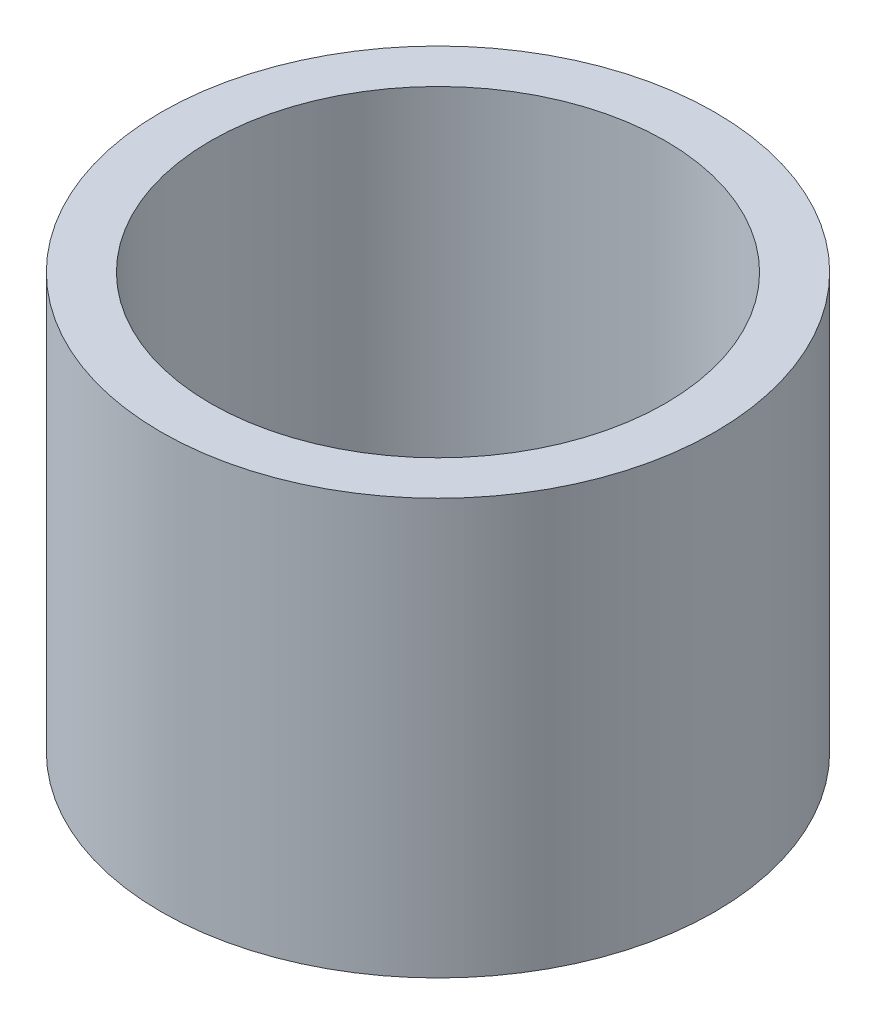
ISO-10303-21;
HEADER;
FILE_DESCRIPTION(('STEP AP214'),'2;1');
FILE_NAME('part.step','',(''),(''),'','','');
FILE_SCHEMA(('AUTOMOTIVE_DESIGN { 1 0 10303 214 1 1 1 1 }'));
ENDSEC;
DATA;
#1=APPLICATION_CONTEXT('core data for automotive mechanical design processes');
#2=APPLICATION_PROTOCOL_DEFINITION('international standard','automotive_design',2000,#1);
#3=PRODUCT_CONTEXT('',#1,'mechanical');
#4=PRODUCT('Part','Part','',(#3));
#5=PRODUCT_RELATED_PRODUCT_CATEGORY('part','',(#4));
#6=PRODUCT_DEFINITION_FORMATION('','',#4);
#7=PRODUCT_DEFINITION_CONTEXT('part definition',#1,'design');
#8=PRODUCT_DEFINITION('design','',#6,#7);
#9=PRODUCT_DEFINITION_SHAPE('','',#8);
#10=(LENGTH_UNIT() NAMED_UNIT(*) SI_UNIT(.MILLI.,.METRE.));
#11=(NAMED_UNIT(*) PLANE_ANGLE_UNIT() SI_UNIT($,.RADIAN.));
#12=(NAMED_UNIT(*) SI_UNIT($,.STERADIAN.) SOLID_ANGLE_UNIT());
#13=UNCERTAINTY_MEASURE_WITH_UNIT(LENGTH_MEASURE(1.E-05),#10,'distance_accuracy_value','');
#14=(GEOMETRIC_REPRESENTATION_CONTEXT(3) GLOBAL_UNCERTAINTY_ASSIGNED_CONTEXT((#13)) GLOBAL_UNIT_ASSIGNED_CONTEXT((#10,
#11,#12)) REPRESENTATION_CONTEXT('',''));
#15=CARTESIAN_POINT('',(0.,0.,0.));
#16=DIRECTION('',(0.,0.,1.));
#17=DIRECTION('',(1.,0.,0.));
#18=AXIS2_PLACEMENT_3D('',#15,#16,#17);
#19=CARTESIAN_POINT('',(0.,19.05,0.));
#20=DIRECTION('',(0.,1.,0.));
#21=DIRECTION('',(0.,0.,1.));
#22=AXIS2_PLACEMENT_3D('',#19,#20,#21);
#23=PLANE('',#22);
#24=CARTESIAN_POINT('',(0.,19.05,0.));
#25=DIRECTION('',(0.,1.,0.));
#26=DIRECTION('',(0.,0.,1.));
#27=AXIS2_PLACEMENT_3D('',#24,#25,#26);
#28=CIRCLE('',#27,12.7);
#29=CARTESIAN_POINT('',(0.,19.05,-12.7));
#30=VERTEX_POINT('',#29);
#31=EDGE_CURVE('E10',#30,#30,#28,.T.);
#32=ORIENTED_EDGE('',*,*,#31,.T.);
#33=EDGE_LOOP('',(#32));
#34=FACE_BOUND('',#33,.T.);
#35=CARTESIAN_POINT('',(0.,19.05,0.));
#36=DIRECTION('',(0.,1.,0.));
#37=DIRECTION('',(0.,0.,1.));
#38=AXIS2_PLACEMENT_3D('',#35,#36,#37);
#39=CIRCLE('',#38,10.4275);
#40=CARTESIAN_POINT('',(0.,19.05,-10.4275));
#41=VERTEX_POINT('',#40);
#42=EDGE_CURVE('E42',#41,#41,#39,.T.);
#43=ORIENTED_EDGE('',*,*,#42,.F.);
#44=EDGE_LOOP('',(#43));
#45=FACE_BOUND('',#44,.T.);
#46=ADVANCED_FACE('F31',(#34,#45),#23,.T.);
#47=CARTESIAN_POINT('',(0.,0.,0.));
#48=DIRECTION('',(0.,1.,0.));
#49=DIRECTION('',(0.,0.,1.));
#50=AXIS2_PLACEMENT_3D('',#47,#48,#49);
#51=PLANE('',#50);
#52=CARTESIAN_POINT('',(0.,0.,0.));
#53=DIRECTION('',(0.,1.,0.));
#54=DIRECTION('',(0.,0.,1.));
#55=AXIS2_PLACEMENT_3D('',#52,#53,#54);
#56=CIRCLE('',#55,12.7);
#57=CARTESIAN_POINT('',(0.,0.,-12.7));
#58=VERTEX_POINT('',#57);
#59=EDGE_CURVE('E35',#58,#58,#56,.T.);
#60=ORIENTED_EDGE('',*,*,#59,.F.);
#61=EDGE_LOOP('',(#60));
#62=FACE_BOUND('',#61,.T.);
#63=CARTESIAN_POINT('',(0.,0.,0.));
#64=DIRECTION('',(0.,1.,0.));
#65=DIRECTION('',(0.,0.,1.));
#66=AXIS2_PLACEMENT_3D('',#63,#64,#65);
#67=CIRCLE('',#66,10.4275);
#68=CARTESIAN_POINT('',(0.,0.,-10.4275));
#69=VERTEX_POINT('',#68);
#70=EDGE_CURVE('E44',#69,#69,#67,.T.);
#71=ORIENTED_EDGE('',*,*,#70,.T.);
#72=EDGE_LOOP('',(#71));
#73=FACE_BOUND('',#72,.T.);
#74=ADVANCED_FACE('F54',(#62,#73),#51,.F.);
#75=CARTESIAN_POINT('',(0.,19.05,0.));
#76=DIRECTION('',(0.,-1.,0.));
#77=DIRECTION('',(0.,0.,-1.));
#78=AXIS2_PLACEMENT_3D('',#75,#76,#77);
#79=CYLINDRICAL_SURFACE('',#78,12.7);
#80=CARTESIAN_POINT('',(0.,19.05,-12.7));
#81=CARTESIAN_POINT('',(0.,18.8515625,-12.7));
#82=CARTESIAN_POINT('',(0.,18.653125,-12.7));
#83=CARTESIAN_POINT('',(0.,18.25625,-12.7));
#84=CARTESIAN_POINT('',(0.,18.0578125,-12.7));
#85=CARTESIAN_POINT('',(0.,17.6609375,-12.7));
#86=CARTESIAN_POINT('',(0.,17.4625,-12.7));
#87=CARTESIAN_POINT('',(0.,17.065625,-12.7));
#88=CARTESIAN_POINT('',(0.,16.8671875,-12.7));
#89=CARTESIAN_POINT('',(0.,16.4703125,-12.7));
#90=CARTESIAN_POINT('',(0.,16.271875,-12.7));
#91=CARTESIAN_POINT('',(0.,15.875,-12.7));
#92=CARTESIAN_POINT('',(0.,15.6765625,-12.7));
#93=CARTESIAN_POINT('',(0.,15.2796875,-12.7));
#94=CARTESIAN_POINT('',(0.,15.08125,-12.7));
#95=CARTESIAN_POINT('',(0.,14.684375,-12.7));
#96=CARTESIAN_POINT('',(0.,14.4859375,-12.7));
#97=CARTESIAN_POINT('',(0.,14.0890625,-12.7));
#98=CARTESIAN_POINT('',(0.,13.890625,-12.7));
#99=CARTESIAN_POINT('',(0.,13.49375,-12.7));
#100=CARTESIAN_POINT('',(0.,13.2953125,-12.7));
#101=CARTESIAN_POINT('',(0.,12.8984375,-12.7));
#102=CARTESIAN_POINT('',(0.,12.7,-12.7));
#103=CARTESIAN_POINT('',(0.,12.303125,-12.7));
#104=CARTESIAN_POINT('',(0.,12.1046875,-12.7));
#105=CARTESIAN_POINT('',(0.,11.7078125,-12.7));
#106=CARTESIAN_POINT('',(0.,11.509375,-12.7));
#107=CARTESIAN_POINT('',(0.,11.1125,-12.7));
#108=CARTESIAN_POINT('',(0.,10.9140625,-12.7));
#109=CARTESIAN_POINT('',(0.,10.5171875,-12.7));
#110=CARTESIAN_POINT('',(0.,10.31875,-12.7));
#111=CARTESIAN_POINT('',(0.,9.921875,-12.7));
#112=CARTESIAN_POINT('',(0.,9.7234375,-12.7));
#113=CARTESIAN_POINT('',(0.,9.3265625,-12.7));
#114=CARTESIAN_POINT('',(0.,9.128125,-12.7));
#115=CARTESIAN_POINT('',(0.,8.73125,-12.7));
#116=CARTESIAN_POINT('',(0.,8.5328125,-12.7));
#117=CARTESIAN_POINT('',(0.,8.1359375,-12.7));
#118=CARTESIAN_POINT('',(0.,7.9375,-12.7));
#119=CARTESIAN_POINT('',(0.,7.540625,-12.7));
#120=CARTESIAN_POINT('',(0.,7.3421875,-12.7));
#121=CARTESIAN_POINT('',(0.,6.9453125,-12.7));
#122=CARTESIAN_POINT('',(0.,6.746875,-12.7));
#123=CARTESIAN_POINT('',(0.,6.35,-12.7));
#124=CARTESIAN_POINT('',(0.,6.1515625,-12.7));
#125=CARTESIAN_POINT('',(0.,5.7546875,-12.7));
#126=CARTESIAN_POINT('',(0.,5.55625,-12.7));
#127=CARTESIAN_POINT('',(0.,5.159375,-12.7));
#128=CARTESIAN_POINT('',(0.,4.9609375,-12.7));
#129=CARTESIAN_POINT('',(0.,4.5640625,-12.7));
#130=CARTESIAN_POINT('',(0.,4.365625,-12.7));
#131=CARTESIAN_POINT('',(0.,3.96875,-12.7));
#132=CARTESIAN_POINT('',(0.,3.7703125,-12.7));
#133=CARTESIAN_POINT('',(0.,3.3734375,-12.7));
#134=CARTESIAN_POINT('',(0.,3.175,-12.7));
#135=CARTESIAN_POINT('',(0.,2.778125,-12.7));
#136=CARTESIAN_POINT('',(0.,2.5796875,-12.7));
#137=CARTESIAN_POINT('',(0.,2.1828125,-12.7));
#138=CARTESIAN_POINT('',(0.,1.984375,-12.7));
#139=CARTESIAN_POINT('',(0.,1.5875,-12.7));
#140=CARTESIAN_POINT('',(0.,1.3890625,-12.7));
#141=CARTESIAN_POINT('',(0.,0.992187500000001,-12.7));
#142=CARTESIAN_POINT('',(0.,0.793750000000001,-12.7));
#143=CARTESIAN_POINT('',(0.,0.396875,-12.7));
#144=CARTESIAN_POINT('',(0.,0.1984375,-12.7));
#145=CARTESIAN_POINT('',(0.,0.,-12.7));
#146=B_SPLINE_CURVE_WITH_KNOTS('',3,(#80,#81,#82,#83,#84,#85,#86,#87,#88,#89,#90,#91,#92,#93,
#94,#95,#96,#97,#98,#99,#100,#101,#102,#103,#104,#105,#106,#107,#108,#109,#110,#111,#112,#113,
#114,#115,#116,#117,#118,#119,#120,#121,#122,#123,#124,#125,#126,#127,#128,#129,#130,#131,#132,
#133,#134,#135,#136,#137,#138,#139,#140,#141,#142,#143,#144,#145),.UNSPECIFIED.,.F.,.F.,(4,2,2,
2,2,2,2,2,2,2,2,2,2,2,2,2,2,2,2,2,2,2,2,2,2,2,2,2,2,2,2,2,4),(0.,0.595312499999997,1.190625,
1.7859375,2.38125,2.9765625,3.571875,4.1671875,4.7625,5.3578125,5.953125,6.5484375,7.14375,
7.7390625,8.334375,8.9296875,9.525,10.1203125,10.715625,11.3109375,11.90625,12.5015625,
13.096875,13.6921875,14.2875,14.8828125,15.478125,16.0734375,16.66875,17.2640625,17.859375,
18.4546875,19.05),.UNSPECIFIED.);
#147=EDGE_CURVE('BSEAM33',#30,#58,#146,.T.);
#148=ORIENTED_EDGE('',*,*,#31,.F.);
#149=ORIENTED_EDGE('',*,*,#59,.T.);
#150=ORIENTED_EDGE('',*,*,#147,.T.);
#151=ORIENTED_EDGE('',*,*,#147,.F.);
#152=EDGE_LOOP('',(#148,#150,#149,#151));
#153=FACE_BOUND('',#152,.T.);
#154=ADVANCED_FACE('F33',(#153),#79,.T.);
#155=CARTESIAN_POINT('',(0.,19.05,0.));
#156=DIRECTION('',(0.,-1.,0.));
#157=DIRECTION('',(0.,0.,-1.));
#158=AXIS2_PLACEMENT_3D('',#155,#156,#157);
#159=CYLINDRICAL_SURFACE('',#158,10.4275);
#160=CARTESIAN_POINT('',(0.,19.05,-10.4275));
#161=CARTESIAN_POINT('',(0.,18.8515625,-10.4275));
#162=CARTESIAN_POINT('',(0.,18.653125,-10.4275));
#163=CARTESIAN_POINT('',(0.,18.25625,-10.4275));
#164=CARTESIAN_POINT('',(0.,18.0578125,-10.4275));
#165=CARTESIAN_POINT('',(0.,17.6609375,-10.4275));
#166=CARTESIAN_POINT('',(0.,17.4625,-10.4275));
#167=CARTESIAN_POINT('',(0.,17.065625,-10.4275));
#168=CARTESIAN_POINT('',(0.,16.8671875,-10.4275));
#169=CARTESIAN_POINT('',(0.,16.4703125,-10.4275));
#170=CARTESIAN_POINT('',(0.,16.271875,-10.4275));
#171=CARTESIAN_POINT('',(0.,15.875,-10.4275));
#172=CARTESIAN_POINT('',(0.,15.6765625,-10.4275));
#173=CARTESIAN_POINT('',(0.,15.2796875,-10.4275));
#174=CARTESIAN_POINT('',(0.,15.08125,-10.4275));
#175=CARTESIAN_POINT('',(0.,14.684375,-10.4275));
#176=CARTESIAN_POINT('',(0.,14.4859375,-10.4275));
#177=CARTESIAN_POINT('',(0.,14.0890625,-10.4275));
#178=CARTESIAN_POINT('',(0.,13.890625,-10.4275));
#179=CARTESIAN_POINT('',(0.,13.49375,-10.4275));
#180=CARTESIAN_POINT('',(0.,13.2953125,-10.4275));
#181=CARTESIAN_POINT('',(0.,12.8984375,-10.4275));
#182=CARTESIAN_POINT('',(0.,12.7,-10.4275));
#183=CARTESIAN_POINT('',(0.,12.303125,-10.4275));
#184=CARTESIAN_POINT('',(0.,12.1046875,-10.4275));
#185=CARTESIAN_POINT('',(0.,11.7078125,-10.4275));
#186=CARTESIAN_POINT('',(0.,11.509375,-10.4275));
#187=CARTESIAN_POINT('',(0.,11.1125,-10.4275));
#188=CARTESIAN_POINT('',(0.,10.9140625,-10.4275));
#189=CARTESIAN_POINT('',(0.,10.5171875,-10.4275));
#190=CARTESIAN_POINT('',(0.,10.31875,-10.4275));
#191=CARTESIAN_POINT('',(0.,9.921875,-10.4275));
#192=CARTESIAN_POINT('',(0.,9.7234375,-10.4275));
#193=CARTESIAN_POINT('',(0.,9.3265625,-10.4275));
#194=CARTESIAN_POINT('',(0.,9.128125,-10.4275));
#195=CARTESIAN_POINT('',(0.,8.73125,-10.4275));
#196=CARTESIAN_POINT('',(0.,8.5328125,-10.4275));
#197=CARTESIAN_POINT('',(0.,8.1359375,-10.4275));
#198=CARTESIAN_POINT('',(0.,7.9375,-10.4275));
#199=CARTESIAN_POINT('',(0.,7.540625,-10.4275));
#200=CARTESIAN_POINT('',(0.,7.3421875,-10.4275));
#201=CARTESIAN_POINT('',(0.,6.9453125,-10.4275));
#202=CARTESIAN_POINT('',(0.,6.746875,-10.4275));
#203=CARTESIAN_POINT('',(0.,6.35,-10.4275));
#204=CARTESIAN_POINT('',(0.,6.1515625,-10.4275));
#205=CARTESIAN_POINT('',(0.,5.7546875,-10.4275));
#206=CARTESIAN_POINT('',(0.,5.55625,-10.4275));
#207=CARTESIAN_POINT('',(0.,5.159375,-10.4275));
#208=CARTESIAN_POINT('',(0.,4.9609375,-10.4275));
#209=CARTESIAN_POINT('',(0.,4.5640625,-10.4275));
#210=CARTESIAN_POINT('',(0.,4.365625,-10.4275));
#211=CARTESIAN_POINT('',(0.,3.96875,-10.4275));
#212=CARTESIAN_POINT('',(0.,3.7703125,-10.4275));
#213=CARTESIAN_POINT('',(0.,3.3734375,-10.4275));
#214=CARTESIAN_POINT('',(0.,3.175,-10.4275));
#215=CARTESIAN_POINT('',(0.,2.778125,-10.4275));
#216=CARTESIAN_POINT('',(0.,2.5796875,-10.4275));
#217=CARTESIAN_POINT('',(0.,2.1828125,-10.4275));
#218=CARTESIAN_POINT('',(0.,1.984375,-10.4275));
#219=CARTESIAN_POINT('',(0.,1.5875,-10.4275));
#220=CARTESIAN_POINT('',(0.,1.3890625,-10.4275));
#221=CARTESIAN_POINT('',(0.,0.992187500000001,-10.4275));
#222=CARTESIAN_POINT('',(0.,0.793750000000001,-10.4275));
#223=CARTESIAN_POINT('',(0.,0.396875,-10.4275));
#224=CARTESIAN_POINT('',(0.,0.1984375,-10.4275));
#225=CARTESIAN_POINT('',(0.,0.,-10.4275));
#226=B_SPLINE_CURVE_WITH_KNOTS('',3,(#160,#161,#162,#163,#164,#165,#166,#167,#168,#169,#170,
#171,#172,#173,#174,#175,#176,#177,#178,#179,#180,#181,#182,#183,#184,#185,#186,#187,#188,#189,
#190,#191,#192,#193,#194,#195,#196,#197,#198,#199,#200,#201,#202,#203,#204,#205,#206,#207,#208,
#209,#210,#211,#212,#213,#214,#215,#216,#217,#218,#219,#220,#221,#222,#223,#224,#225),
.UNSPECIFIED.,.F.,.F.,(4,2,2,2,2,2,2,2,2,2,2,2,2,2,2,2,2,2,2,2,2,2,2,2,2,2,2,2,2,2,2,2,4),(0.,
0.5953125,1.190625,1.7859375,2.38125,2.9765625,3.571875,4.1671875,4.7625,5.3578125,5.953125,
6.5484375,7.14375,7.7390625,8.334375,8.9296875,9.525,10.1203125,10.715625,11.3109375,11.90625,
12.5015625,13.096875,13.6921875,14.2875,14.8828125,15.478125,16.0734375,16.66875,17.2640625,
17.859375,18.4546875,19.05),.UNSPECIFIED.);
#227=EDGE_CURVE('BSEAM50',#41,#69,#226,.T.);
#228=ORIENTED_EDGE('',*,*,#42,.T.);
#229=ORIENTED_EDGE('',*,*,#70,.F.);
#230=ORIENTED_EDGE('',*,*,#227,.T.);
#231=ORIENTED_EDGE('',*,*,#227,.F.);
#232=EDGE_LOOP('',(#228,#230,#229,#231));
#233=FACE_BOUND('',#232,.T.);
#234=ADVANCED_FACE('F50',(#233),#159,.F.);
#235=CLOSED_SHELL('',(#46,#74,#154,#234));
#236=MANIFOLD_SOLID_BREP('B2',#235);
#237=ADVANCED_BREP_SHAPE_REPRESENTATION('',(#18,#236),#14);
#238=SHAPE_DEFINITION_REPRESENTATION(#9,#237);
ENDSEC;
END-ISO-10303-21;
